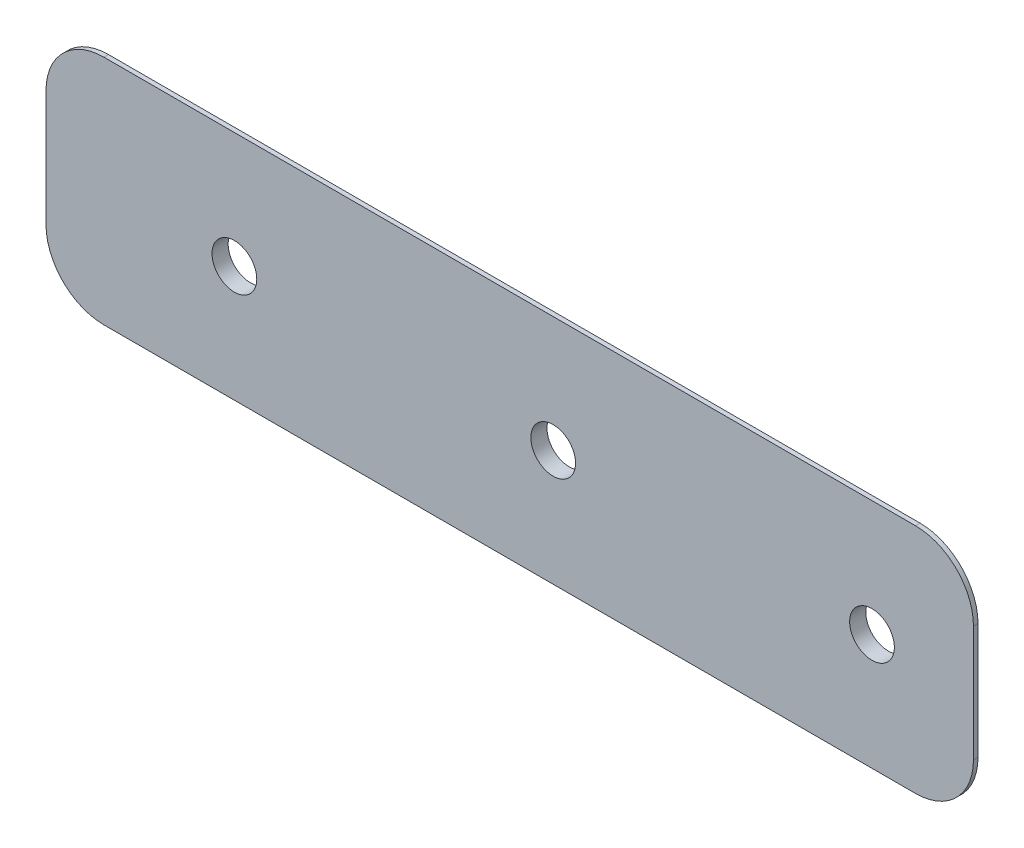
ISO-10303-21;
HEADER;
FILE_DESCRIPTION(('STEP AP214'),'2;1');
FILE_NAME('part.step','',(''),(''),'','','');
FILE_SCHEMA(('AUTOMOTIVE_DESIGN { 1 0 10303 214 1 1 1 1 }'));
ENDSEC;
DATA;
#1=APPLICATION_CONTEXT('core data for automotive mechanical design processes');
#2=APPLICATION_PROTOCOL_DEFINITION('international standard','automotive_design',2000,#1);
#3=PRODUCT_CONTEXT('',#1,'mechanical');
#4=PRODUCT('Part','Part','',(#3));
#5=PRODUCT_RELATED_PRODUCT_CATEGORY('part','',(#4));
#6=PRODUCT_DEFINITION_FORMATION('','',#4);
#7=PRODUCT_DEFINITION_CONTEXT('part definition',#1,'design');
#8=PRODUCT_DEFINITION('design','',#6,#7);
#9=PRODUCT_DEFINITION_SHAPE('','',#8);
#10=(LENGTH_UNIT() NAMED_UNIT(*) SI_UNIT(.MILLI.,.METRE.));
#11=(NAMED_UNIT(*) PLANE_ANGLE_UNIT() SI_UNIT($,.RADIAN.));
#12=(NAMED_UNIT(*) SI_UNIT($,.STERADIAN.) SOLID_ANGLE_UNIT());
#13=UNCERTAINTY_MEASURE_WITH_UNIT(LENGTH_MEASURE(1.E-05),#10,'distance_accuracy_value','');
#14=(GEOMETRIC_REPRESENTATION_CONTEXT(3) GLOBAL_UNCERTAINTY_ASSIGNED_CONTEXT((#13)) GLOBAL_UNIT_ASSIGNED_CONTEXT((#10,
#11,#12)) REPRESENTATION_CONTEXT('',''));
#15=CARTESIAN_POINT('',(0.,0.,0.));
#16=DIRECTION('',(0.,0.,1.));
#17=DIRECTION('',(1.,0.,0.));
#18=AXIS2_PLACEMENT_3D('',#15,#16,#17);
#19=CARTESIAN_POINT('',(92.075,0.,1.));
#20=DIRECTION('',(1.,0.,0.));
#21=DIRECTION('',(0.,0.,-1.));
#22=AXIS2_PLACEMENT_3D('',#19,#20,#21);
#23=PLANE('',#22);
#24=DIRECTION('',(0.,-1.,0.));
#25=VECTOR('',#24,1.);
#26=CARTESIAN_POINT('',(92.075,0.,1.));
#27=LINE('',#26,#25);
#28=CARTESIAN_POINT('',(92.075,12.7,1.));
#29=VERTEX_POINT('',#28);
#30=CARTESIAN_POINT('',(92.075,-12.7,1.));
#31=VERTEX_POINT('',#30);
#32=EDGE_CURVE('E141',#29,#31,#27,.T.);
#33=ORIENTED_EDGE('',*,*,#32,.T.);
#34=DIRECTION('',(0.,0.,-1.));
#35=VECTOR('',#34,1.);
#36=CARTESIAN_POINT('',(92.075,-12.7,0.));
#37=LINE('',#36,#35);
#38=CARTESIAN_POINT('',(92.075,-12.7,0.));
#39=VERTEX_POINT('',#38);
#40=EDGE_CURVE('E11',#31,#39,#37,.T.);
#41=ORIENTED_EDGE('',*,*,#40,.T.);
#42=DIRECTION('',(0.,-1.,0.));
#43=VECTOR('',#42,1.);
#44=CARTESIAN_POINT('',(92.075,0.,0.));
#45=LINE('',#44,#43);
#46=CARTESIAN_POINT('',(92.075,12.7,0.));
#47=VERTEX_POINT('',#46);
#48=EDGE_CURVE('E172',#47,#39,#45,.T.);
#49=ORIENTED_EDGE('',*,*,#48,.F.);
#50=DIRECTION('',(0.,0.,-1.));
#51=VECTOR('',#50,1.);
#52=CARTESIAN_POINT('',(92.075,12.7,1.));
#53=LINE('',#52,#51);
#54=EDGE_CURVE('E55',#47,#29,#53,.F.);
#55=ORIENTED_EDGE('',*,*,#54,.T.);
#56=EDGE_LOOP('',(#33,#41,#49,#55));
#57=FACE_BOUND('',#56,.T.);
#58=ADVANCED_FACE('F47',(#57),#23,.T.);
#59=CARTESIAN_POINT('',(0.,25.4,1.));
#60=DIRECTION('',(0.,1.,0.));
#61=DIRECTION('',(0.,0.,1.));
#62=AXIS2_PLACEMENT_3D('',#59,#60,#61);
#63=PLANE('',#62);
#64=DIRECTION('',(1.,0.,0.));
#65=VECTOR('',#64,1.);
#66=CARTESIAN_POINT('',(0.,25.4,0.));
#67=LINE('',#66,#65);
#68=CARTESIAN_POINT('',(-98.425,25.4,0.));
#69=VERTEX_POINT('',#68);
#70=CARTESIAN_POINT('',(79.375,25.4,0.));
#71=VERTEX_POINT('',#70);
#72=EDGE_CURVE('E147',#69,#71,#67,.T.);
#73=ORIENTED_EDGE('',*,*,#72,.F.);
#74=DIRECTION('',(0.,0.,-1.));
#75=VECTOR('',#74,1.);
#76=CARTESIAN_POINT('',(-98.425,25.4,1.));
#77=LINE('',#76,#75);
#78=CARTESIAN_POINT('',(-98.425,25.4,1.));
#79=VERTEX_POINT('',#78);
#80=EDGE_CURVE('E69',#69,#79,#77,.F.);
#81=ORIENTED_EDGE('',*,*,#80,.T.);
#82=DIRECTION('',(1.,0.,0.));
#83=VECTOR('',#82,1.);
#84=CARTESIAN_POINT('',(0.,25.4,1.));
#85=LINE('',#84,#83);
#86=CARTESIAN_POINT('',(79.375,25.4,1.));
#87=VERTEX_POINT('',#86);
#88=EDGE_CURVE('E145',#79,#87,#85,.T.);
#89=ORIENTED_EDGE('',*,*,#88,.T.);
#90=DIRECTION('',(0.,0.,-1.));
#91=VECTOR('',#90,1.);
#92=CARTESIAN_POINT('',(79.375,25.4,1.));
#93=LINE('',#92,#91);
#94=EDGE_CURVE('E165',#87,#71,#93,.T.);
#95=ORIENTED_EDGE('',*,*,#94,.T.);
#96=EDGE_LOOP('',(#73,#81,#89,#95));
#97=FACE_BOUND('',#96,.T.);
#98=ADVANCED_FACE('F179',(#97),#63,.T.);
#99=CARTESIAN_POINT('',(-111.125,0.,1.));
#100=DIRECTION('',(1.,0.,0.));
#101=DIRECTION('',(0.,0.,-1.));
#102=AXIS2_PLACEMENT_3D('',#99,#100,#101);
#103=PLANE('',#102);
#104=DIRECTION('',(0.,-1.,0.));
#105=VECTOR('',#104,1.);
#106=CARTESIAN_POINT('',(-111.125,0.,0.));
#107=LINE('',#106,#105);
#108=CARTESIAN_POINT('',(-111.125,12.7,0.));
#109=VERTEX_POINT('',#108);
#110=CARTESIAN_POINT('',(-111.125,-12.7,0.));
#111=VERTEX_POINT('',#110);
#112=EDGE_CURVE('E142',#109,#111,#107,.T.);
#113=ORIENTED_EDGE('',*,*,#112,.T.);
#114=DIRECTION('',(0.,0.,-1.));
#115=VECTOR('',#114,1.);
#116=CARTESIAN_POINT('',(-111.125,-12.7,1.));
#117=LINE('',#116,#115);
#118=CARTESIAN_POINT('',(-111.125,-12.7,1.));
#119=VERTEX_POINT('',#118);
#120=EDGE_CURVE('E119',#111,#119,#117,.F.);
#121=ORIENTED_EDGE('',*,*,#120,.T.);
#122=DIRECTION('',(0.,-1.,0.));
#123=VECTOR('',#122,1.);
#124=CARTESIAN_POINT('',(-111.125,0.,1.));
#125=LINE('',#124,#123);
#126=CARTESIAN_POINT('',(-111.125,12.7,1.));
#127=VERTEX_POINT('',#126);
#128=EDGE_CURVE('E184',#127,#119,#125,.T.);
#129=ORIENTED_EDGE('',*,*,#128,.F.);
#130=DIRECTION('',(0.,0.,-1.));
#131=VECTOR('',#130,1.);
#132=CARTESIAN_POINT('',(-111.125,12.7,0.));
#133=LINE('',#132,#131);
#134=EDGE_CURVE('E124',#127,#109,#133,.T.);
#135=ORIENTED_EDGE('',*,*,#134,.T.);
#136=EDGE_LOOP('',(#113,#121,#129,#135));
#137=FACE_BOUND('',#136,.T.);
#138=ADVANCED_FACE('F254',(#137),#103,.F.);
#139=CARTESIAN_POINT('',(0.,-25.4,1.));
#140=DIRECTION('',(0.,1.,0.));
#141=DIRECTION('',(0.,0.,1.));
#142=AXIS2_PLACEMENT_3D('',#139,#140,#141);
#143=PLANE('',#142);
#144=DIRECTION('',(1.,0.,0.));
#145=VECTOR('',#144,1.);
#146=CARTESIAN_POINT('',(0.,-25.4,1.));
#147=LINE('',#146,#145);
#148=CARTESIAN_POINT('',(-98.425,-25.4,1.));
#149=VERTEX_POINT('',#148);
#150=CARTESIAN_POINT('',(79.375,-25.4,1.));
#151=VERTEX_POINT('',#150);
#152=EDGE_CURVE('E134',#149,#151,#147,.T.);
#153=ORIENTED_EDGE('',*,*,#152,.F.);
#154=DIRECTION('',(0.,0.,-1.));
#155=VECTOR('',#154,1.);
#156=CARTESIAN_POINT('',(-98.425,-25.4,1.));
#157=LINE('',#156,#155);
#158=CARTESIAN_POINT('',(-98.425,-25.4,0.));
#159=VERTEX_POINT('',#158);
#160=EDGE_CURVE('E118',#149,#159,#157,.T.);
#161=ORIENTED_EDGE('',*,*,#160,.T.);
#162=DIRECTION('',(1.,0.,0.));
#163=VECTOR('',#162,1.);
#164=CARTESIAN_POINT('',(0.,-25.4,0.));
#165=LINE('',#164,#163);
#166=CARTESIAN_POINT('',(79.375,-25.4,0.));
#167=VERTEX_POINT('',#166);
#168=EDGE_CURVE('E131',#159,#167,#165,.T.);
#169=ORIENTED_EDGE('',*,*,#168,.T.);
#170=DIRECTION('',(0.,0.,-1.));
#171=VECTOR('',#170,1.);
#172=CARTESIAN_POINT('',(79.375,-25.4,1.));
#173=LINE('',#172,#171);
#174=EDGE_CURVE('E136',#167,#151,#173,.F.);
#175=ORIENTED_EDGE('',*,*,#174,.T.);
#176=EDGE_LOOP('',(#153,#161,#169,#175));
#177=FACE_BOUND('',#176,.T.);
#178=ADVANCED_FACE('F130',(#177),#143,.F.);
#179=CARTESIAN_POINT('',(0.,0.,1.));
#180=DIRECTION('',(0.,0.,1.));
#181=DIRECTION('',(1.,0.,0.));
#182=AXIS2_PLACEMENT_3D('',#179,#180,#181);
#183=PLANE('',#182);
#184=CARTESIAN_POINT('',(69.85,0.,1.));
#185=DIRECTION('',(0.,0.,1.));
#186=DIRECTION('',(1.,0.,0.));
#187=AXIS2_PLACEMENT_3D('',#184,#185,#186);
#188=CIRCLE('',#187,4.9022);
#189=CARTESIAN_POINT('',(74.7522,0.,1.));
#190=VERTEX_POINT('',#189);
#191=EDGE_CURVE('E219',#190,#190,#188,.T.);
#192=ORIENTED_EDGE('',*,*,#191,.F.);
#193=EDGE_LOOP('',(#192));
#194=FACE_BOUND('',#193,.T.);
#195=CARTESIAN_POINT('',(0.,0.,1.));
#196=DIRECTION('',(0.,0.,1.));
#197=DIRECTION('',(1.,0.,0.));
#198=AXIS2_PLACEMENT_3D('',#195,#196,#197);
#199=CIRCLE('',#198,4.90219999999999);
#200=CARTESIAN_POINT('',(4.90219999999999,0.,1.));
#201=VERTEX_POINT('',#200);
#202=EDGE_CURVE('E213',#201,#201,#199,.T.);
#203=ORIENTED_EDGE('',*,*,#202,.F.);
#204=EDGE_LOOP('',(#203));
#205=FACE_BOUND('',#204,.T.);
#206=CARTESIAN_POINT('',(-69.85,0.,1.));
#207=DIRECTION('',(0.,0.,1.));
#208=DIRECTION('',(1.,0.,0.));
#209=AXIS2_PLACEMENT_3D('',#206,#207,#208);
#210=CIRCLE('',#209,4.9022);
#211=CARTESIAN_POINT('',(-64.9478,0.,1.));
#212=VERTEX_POINT('',#211);
#213=EDGE_CURVE('E207',#212,#212,#210,.T.);
#214=ORIENTED_EDGE('',*,*,#213,.F.);
#215=EDGE_LOOP('',(#214));
#216=FACE_BOUND('',#215,.T.);
#217=ORIENTED_EDGE('',*,*,#128,.T.);
#218=CARTESIAN_POINT('',(-98.425,-12.7,1.));
#219=DIRECTION('',(0.,0.,1.));
#220=DIRECTION('',(1.,0.,0.));
#221=AXIS2_PLACEMENT_3D('',#218,#219,#220);
#222=CIRCLE('',#221,12.7);
#223=EDGE_CURVE('E163',#119,#149,#222,.T.);
#224=ORIENTED_EDGE('',*,*,#223,.T.);
#225=ORIENTED_EDGE('',*,*,#152,.T.);
#226=CARTESIAN_POINT('',(79.375,-12.7,1.));
#227=DIRECTION('',(0.,0.,1.));
#228=DIRECTION('',(1.,0.,0.));
#229=AXIS2_PLACEMENT_3D('',#226,#227,#228);
#230=CIRCLE('',#229,12.7);
#231=EDGE_CURVE('E159',#151,#31,#230,.T.);
#232=ORIENTED_EDGE('',*,*,#231,.T.);
#233=ORIENTED_EDGE('',*,*,#32,.F.);
#234=CARTESIAN_POINT('',(79.375,12.7,1.));
#235=DIRECTION('',(0.,0.,1.));
#236=DIRECTION('',(1.,0.,0.));
#237=AXIS2_PLACEMENT_3D('',#234,#235,#236);
#238=CIRCLE('',#237,12.7);
#239=EDGE_CURVE('E62',#29,#87,#238,.T.);
#240=ORIENTED_EDGE('',*,*,#239,.T.);
#241=ORIENTED_EDGE('',*,*,#88,.F.);
#242=CARTESIAN_POINT('',(-98.425,12.7,1.));
#243=DIRECTION('',(0.,0.,1.));
#244=DIRECTION('',(1.,0.,0.));
#245=AXIS2_PLACEMENT_3D('',#242,#243,#244);
#246=CIRCLE('',#245,12.7);
#247=EDGE_CURVE('E161',#79,#127,#246,.T.);
#248=ORIENTED_EDGE('',*,*,#247,.T.);
#249=EDGE_LOOP('',(#217,#224,#225,#232,#233,#240,#241,#248));
#250=FACE_BOUND('',#249,.T.);
#251=ADVANCED_FACE('F175',(#194,#205,#216,#250),#183,.T.);
#252=CARTESIAN_POINT('',(0.,0.,0.));
#253=DIRECTION('',(0.,0.,1.));
#254=DIRECTION('',(1.,0.,0.));
#255=AXIS2_PLACEMENT_3D('',#252,#253,#254);
#256=PLANE('',#255);
#257=CARTESIAN_POINT('',(-69.85,0.,0.));
#258=DIRECTION('',(0.,0.,1.));
#259=DIRECTION('',(1.,0.,0.));
#260=AXIS2_PLACEMENT_3D('',#257,#258,#259);
#261=CIRCLE('',#260,6.477);
#262=CARTESIAN_POINT('',(-63.373,0.,0.));
#263=VERTEX_POINT('',#262);
#264=EDGE_CURVE('E200',#263,#263,#261,.T.);
#265=ORIENTED_EDGE('',*,*,#264,.T.);
#266=EDGE_LOOP('',(#265));
#267=FACE_BOUND('',#266,.T.);
#268=CARTESIAN_POINT('',(0.,0.,0.));
#269=DIRECTION('',(0.,0.,1.));
#270=DIRECTION('',(1.,0.,0.));
#271=AXIS2_PLACEMENT_3D('',#268,#269,#270);
#272=CIRCLE('',#271,6.477);
#273=CARTESIAN_POINT('',(6.477,0.,0.));
#274=VERTEX_POINT('',#273);
#275=EDGE_CURVE('E197',#274,#274,#272,.T.);
#276=ORIENTED_EDGE('',*,*,#275,.T.);
#277=EDGE_LOOP('',(#276));
#278=FACE_BOUND('',#277,.T.);
#279=CARTESIAN_POINT('',(69.85,0.,0.));
#280=DIRECTION('',(0.,0.,1.));
#281=DIRECTION('',(1.,0.,0.));
#282=AXIS2_PLACEMENT_3D('',#279,#280,#281);
#283=CIRCLE('',#282,6.477);
#284=CARTESIAN_POINT('',(76.327,0.,0.));
#285=VERTEX_POINT('',#284);
#286=EDGE_CURVE('E190',#285,#285,#283,.T.);
#287=ORIENTED_EDGE('',*,*,#286,.T.);
#288=EDGE_LOOP('',(#287));
#289=FACE_BOUND('',#288,.T.);
#290=ORIENTED_EDGE('',*,*,#168,.F.);
#291=CARTESIAN_POINT('',(-98.425,-12.7,0.));
#292=DIRECTION('',(0.,0.,1.));
#293=DIRECTION('',(1.,0.,0.));
#294=AXIS2_PLACEMENT_3D('',#291,#292,#293);
#295=CIRCLE('',#294,12.7);
#296=EDGE_CURVE('E114',#159,#111,#295,.F.);
#297=ORIENTED_EDGE('',*,*,#296,.T.);
#298=ORIENTED_EDGE('',*,*,#112,.F.);
#299=CARTESIAN_POINT('',(-98.425,12.7,0.));
#300=DIRECTION('',(0.,0.,1.));
#301=DIRECTION('',(1.,0.,0.));
#302=AXIS2_PLACEMENT_3D('',#299,#300,#301);
#303=CIRCLE('',#302,12.7);
#304=EDGE_CURVE('E125',#109,#69,#303,.F.);
#305=ORIENTED_EDGE('',*,*,#304,.T.);
#306=ORIENTED_EDGE('',*,*,#72,.T.);
#307=CARTESIAN_POINT('',(79.375,12.7,0.));
#308=DIRECTION('',(0.,0.,1.));
#309=DIRECTION('',(1.,0.,0.));
#310=AXIS2_PLACEMENT_3D('',#307,#308,#309);
#311=CIRCLE('',#310,12.7);
#312=EDGE_CURVE('E135',#71,#47,#311,.F.);
#313=ORIENTED_EDGE('',*,*,#312,.T.);
#314=ORIENTED_EDGE('',*,*,#48,.T.);
#315=CARTESIAN_POINT('',(79.375,-12.7,0.));
#316=DIRECTION('',(0.,0.,1.));
#317=DIRECTION('',(1.,0.,0.));
#318=AXIS2_PLACEMENT_3D('',#315,#316,#317);
#319=CIRCLE('',#318,12.7);
#320=EDGE_CURVE('E140',#39,#167,#319,.F.);
#321=ORIENTED_EDGE('',*,*,#320,.T.);
#322=EDGE_LOOP('',(#290,#297,#298,#305,#306,#313,#314,#321));
#323=FACE_BOUND('',#322,.T.);
#324=ADVANCED_FACE('F138',(#267,#278,#289,#323),#256,.F.);
#325=CARTESIAN_POINT('',(69.85,0.,-2.54));
#326=DIRECTION('',(0.,0.,1.));
#327=DIRECTION('',(1.,0.,0.));
#328=AXIS2_PLACEMENT_3D('',#325,#326,#327);
#329=CYLINDRICAL_SURFACE('',#328,6.477);
#330=CARTESIAN_POINT('',(69.85,0.,-2.54));
#331=DIRECTION('',(0.,0.,1.));
#332=DIRECTION('',(1.,0.,0.));
#333=AXIS2_PLACEMENT_3D('',#330,#331,#332);
#334=CIRCLE('',#333,6.477);
#335=CARTESIAN_POINT('',(76.327,0.,-2.54));
#336=VERTEX_POINT('',#335);
#337=EDGE_CURVE('E187',#336,#336,#334,.T.);
#338=ORIENTED_EDGE('',*,*,#337,.T.);
#339=EDGE_LOOP('',(#338));
#340=FACE_BOUND('',#339,.T.);
#341=ORIENTED_EDGE('',*,*,#286,.F.);
#342=EDGE_LOOP('',(#341));
#343=FACE_BOUND('',#342,.T.);
#344=ADVANCED_FACE('F280',(#340,#343),#329,.T.);
#345=CARTESIAN_POINT('',(69.85,0.,-2.54));
#346=DIRECTION('',(0.,0.,1.));
#347=DIRECTION('',(1.,0.,0.));
#348=AXIS2_PLACEMENT_3D('',#345,#346,#347);
#349=PLANE('',#348);
#350=CARTESIAN_POINT('',(69.85,0.,-2.54));
#351=DIRECTION('',(0.,0.,1.));
#352=DIRECTION('',(1.,0.,0.));
#353=AXIS2_PLACEMENT_3D('',#350,#351,#352);
#354=CIRCLE('',#353,4.9022);
#355=CARTESIAN_POINT('',(74.7522,0.,-2.54));
#356=VERTEX_POINT('',#355);
#357=EDGE_CURVE('E216',#356,#356,#354,.T.);
#358=ORIENTED_EDGE('',*,*,#357,.T.);
#359=EDGE_LOOP('',(#358));
#360=FACE_BOUND('',#359,.T.);
#361=ORIENTED_EDGE('',*,*,#337,.F.);
#362=EDGE_LOOP('',(#361));
#363=FACE_BOUND('',#362,.T.);
#364=ADVANCED_FACE('F283',(#360,#363),#349,.F.);
#365=CARTESIAN_POINT('',(0.,0.,-2.54));
#366=DIRECTION('',(0.,0.,1.));
#367=DIRECTION('',(1.,0.,0.));
#368=AXIS2_PLACEMENT_3D('',#365,#366,#367);
#369=CYLINDRICAL_SURFACE('',#368,6.477);
#370=CARTESIAN_POINT('',(0.,0.,-2.54));
#371=DIRECTION('',(0.,0.,1.));
#372=DIRECTION('',(1.,0.,0.));
#373=AXIS2_PLACEMENT_3D('',#370,#371,#372);
#374=CIRCLE('',#373,6.477);
#375=CARTESIAN_POINT('',(6.477,0.,-2.54));
#376=VERTEX_POINT('',#375);
#377=EDGE_CURVE('E194',#376,#376,#374,.T.);
#378=ORIENTED_EDGE('',*,*,#377,.T.);
#379=EDGE_LOOP('',(#378));
#380=FACE_BOUND('',#379,.T.);
#381=ORIENTED_EDGE('',*,*,#275,.F.);
#382=EDGE_LOOP('',(#381));
#383=FACE_BOUND('',#382,.T.);
#384=ADVANCED_FACE('F286',(#380,#383),#369,.T.);
#385=CARTESIAN_POINT('',(0.,0.,-2.54));
#386=DIRECTION('',(0.,0.,1.));
#387=DIRECTION('',(1.,0.,0.));
#388=AXIS2_PLACEMENT_3D('',#385,#386,#387);
#389=PLANE('',#388);
#390=CARTESIAN_POINT('',(0.,0.,-2.54));
#391=DIRECTION('',(0.,0.,1.));
#392=DIRECTION('',(1.,0.,0.));
#393=AXIS2_PLACEMENT_3D('',#390,#391,#392);
#394=CIRCLE('',#393,4.9022);
#395=CARTESIAN_POINT('',(4.9022,0.,-2.54));
#396=VERTEX_POINT('',#395);
#397=EDGE_CURVE('E210',#396,#396,#394,.T.);
#398=ORIENTED_EDGE('',*,*,#397,.T.);
#399=EDGE_LOOP('',(#398));
#400=FACE_BOUND('',#399,.T.);
#401=ORIENTED_EDGE('',*,*,#377,.F.);
#402=EDGE_LOOP('',(#401));
#403=FACE_BOUND('',#402,.T.);
#404=ADVANCED_FACE('F291',(#400,#403),#389,.F.);
#405=CARTESIAN_POINT('',(-69.85,0.,-2.54));
#406=DIRECTION('',(0.,0.,1.));
#407=DIRECTION('',(1.,0.,0.));
#408=AXIS2_PLACEMENT_3D('',#405,#406,#407);
#409=CYLINDRICAL_SURFACE('',#408,6.477);
#410=CARTESIAN_POINT('',(-69.85,0.,-2.54));
#411=DIRECTION('',(0.,0.,1.));
#412=DIRECTION('',(1.,0.,0.));
#413=AXIS2_PLACEMENT_3D('',#410,#411,#412);
#414=CIRCLE('',#413,6.477);
#415=CARTESIAN_POINT('',(-63.373,0.,-2.54));
#416=VERTEX_POINT('',#415);
#417=EDGE_CURVE('E180',#416,#416,#414,.T.);
#418=ORIENTED_EDGE('',*,*,#417,.T.);
#419=EDGE_LOOP('',(#418));
#420=FACE_BOUND('',#419,.T.);
#421=ORIENTED_EDGE('',*,*,#264,.F.);
#422=EDGE_LOOP('',(#421));
#423=FACE_BOUND('',#422,.T.);
#424=ADVANCED_FACE('F244',(#420,#423),#409,.T.);
#425=CARTESIAN_POINT('',(-69.85,0.,-2.54));
#426=DIRECTION('',(0.,0.,1.));
#427=DIRECTION('',(1.,0.,0.));
#428=AXIS2_PLACEMENT_3D('',#425,#426,#427);
#429=PLANE('',#428);
#430=CARTESIAN_POINT('',(-69.85,0.,-2.54));
#431=DIRECTION('',(0.,0.,1.));
#432=DIRECTION('',(1.,0.,0.));
#433=AXIS2_PLACEMENT_3D('',#430,#431,#432);
#434=CIRCLE('',#433,4.9022);
#435=CARTESIAN_POINT('',(-64.9478,0.,-2.54));
#436=VERTEX_POINT('',#435);
#437=EDGE_CURVE('E191',#436,#436,#434,.T.);
#438=ORIENTED_EDGE('',*,*,#437,.T.);
#439=EDGE_LOOP('',(#438));
#440=FACE_BOUND('',#439,.T.);
#441=ORIENTED_EDGE('',*,*,#417,.F.);
#442=EDGE_LOOP('',(#441));
#443=FACE_BOUND('',#442,.T.);
#444=ADVANCED_FACE('F235',(#440,#443),#429,.F.);
#445=CARTESIAN_POINT('',(-69.85,0.,1.));
#446=DIRECTION('',(0.,0.,1.));
#447=DIRECTION('',(1.,0.,0.));
#448=AXIS2_PLACEMENT_3D('',#445,#446,#447);
#449=CYLINDRICAL_SURFACE('',#448,4.9022);
#450=ORIENTED_EDGE('',*,*,#437,.F.);
#451=EDGE_LOOP('',(#450));
#452=FACE_BOUND('',#451,.T.);
#453=ORIENTED_EDGE('',*,*,#213,.T.);
#454=EDGE_LOOP('',(#453));
#455=FACE_BOUND('',#454,.T.);
#456=ADVANCED_FACE('F232',(#452,#455),#449,.F.);
#457=CARTESIAN_POINT('',(0.,0.,1.));
#458=DIRECTION('',(0.,0.,1.));
#459=DIRECTION('',(1.,0.,0.));
#460=AXIS2_PLACEMENT_3D('',#457,#458,#459);
#461=CYLINDRICAL_SURFACE('',#460,4.90219999999999);
#462=ORIENTED_EDGE('',*,*,#397,.F.);
#463=EDGE_LOOP('',(#462));
#464=FACE_BOUND('',#463,.T.);
#465=ORIENTED_EDGE('',*,*,#202,.T.);
#466=EDGE_LOOP('',(#465));
#467=FACE_BOUND('',#466,.T.);
#468=ADVANCED_FACE('F234',(#464,#467),#461,.F.);
#469=CARTESIAN_POINT('',(69.85,0.,1.));
#470=DIRECTION('',(0.,0.,1.));
#471=DIRECTION('',(1.,0.,0.));
#472=AXIS2_PLACEMENT_3D('',#469,#470,#471);
#473=CYLINDRICAL_SURFACE('',#472,4.9022);
#474=ORIENTED_EDGE('',*,*,#357,.F.);
#475=EDGE_LOOP('',(#474));
#476=FACE_BOUND('',#475,.T.);
#477=ORIENTED_EDGE('',*,*,#191,.T.);
#478=EDGE_LOOP('',(#477));
#479=FACE_BOUND('',#478,.T.);
#480=ADVANCED_FACE('F223',(#476,#479),#473,.F.);
#481=CARTESIAN_POINT('',(-98.425,-12.7,1.));
#482=DIRECTION('',(0.,0.,-1.));
#483=DIRECTION('',(-1.,0.,0.));
#484=AXIS2_PLACEMENT_3D('',#481,#482,#483);
#485=CYLINDRICAL_SURFACE('',#484,12.7);
#486=ORIENTED_EDGE('',*,*,#223,.F.);
#487=ORIENTED_EDGE('',*,*,#120,.F.);
#488=ORIENTED_EDGE('',*,*,#296,.F.);
#489=ORIENTED_EDGE('',*,*,#160,.F.);
#490=EDGE_LOOP('',(#486,#487,#488,#489));
#491=FACE_BOUND('',#490,.T.);
#492=ADVANCED_FACE('F117',(#491),#485,.T.);
#493=CARTESIAN_POINT('',(-98.425,12.7,1.));
#494=DIRECTION('',(0.,0.,1.));
#495=DIRECTION('',(1.,0.,0.));
#496=AXIS2_PLACEMENT_3D('',#493,#494,#495);
#497=CYLINDRICAL_SURFACE('',#496,12.7);
#498=ORIENTED_EDGE('',*,*,#247,.F.);
#499=ORIENTED_EDGE('',*,*,#80,.F.);
#500=ORIENTED_EDGE('',*,*,#304,.F.);
#501=ORIENTED_EDGE('',*,*,#134,.F.);
#502=EDGE_LOOP('',(#498,#499,#500,#501));
#503=FACE_BOUND('',#502,.T.);
#504=ADVANCED_FACE('F260',(#503),#497,.T.);
#505=CARTESIAN_POINT('',(79.375,-12.7,1.));
#506=DIRECTION('',(0.,0.,1.));
#507=DIRECTION('',(1.,0.,0.));
#508=AXIS2_PLACEMENT_3D('',#505,#506,#507);
#509=CYLINDRICAL_SURFACE('',#508,12.7);
#510=ORIENTED_EDGE('',*,*,#231,.F.);
#511=ORIENTED_EDGE('',*,*,#174,.F.);
#512=ORIENTED_EDGE('',*,*,#320,.F.);
#513=ORIENTED_EDGE('',*,*,#40,.F.);
#514=EDGE_LOOP('',(#510,#511,#512,#513));
#515=FACE_BOUND('',#514,.T.);
#516=ADVANCED_FACE('F262',(#515),#509,.T.);
#517=CARTESIAN_POINT('',(79.375,12.7,1.));
#518=DIRECTION('',(0.,0.,-1.));
#519=DIRECTION('',(-1.,0.,0.));
#520=AXIS2_PLACEMENT_3D('',#517,#518,#519);
#521=CYLINDRICAL_SURFACE('',#520,12.7);
#522=ORIENTED_EDGE('',*,*,#239,.F.);
#523=ORIENTED_EDGE('',*,*,#54,.F.);
#524=ORIENTED_EDGE('',*,*,#312,.F.);
#525=ORIENTED_EDGE('',*,*,#94,.F.);
#526=EDGE_LOOP('',(#522,#523,#524,#525));
#527=FACE_BOUND('',#526,.T.);
#528=ADVANCED_FACE('F49',(#527),#521,.T.);
#529=CLOSED_SHELL('',(#58,#98,#138,#178,#251,#324,#344,#364,#384,#404,#424,#444,#456,#468,#480,
#492,#504,#516,#528));
#530=MANIFOLD_SOLID_BREP('B2',#529);
#531=ADVANCED_BREP_SHAPE_REPRESENTATION('',(#18,#530),#14);
#532=SHAPE_DEFINITION_REPRESENTATION(#9,#531);
ENDSEC;
END-ISO-10303-21;
